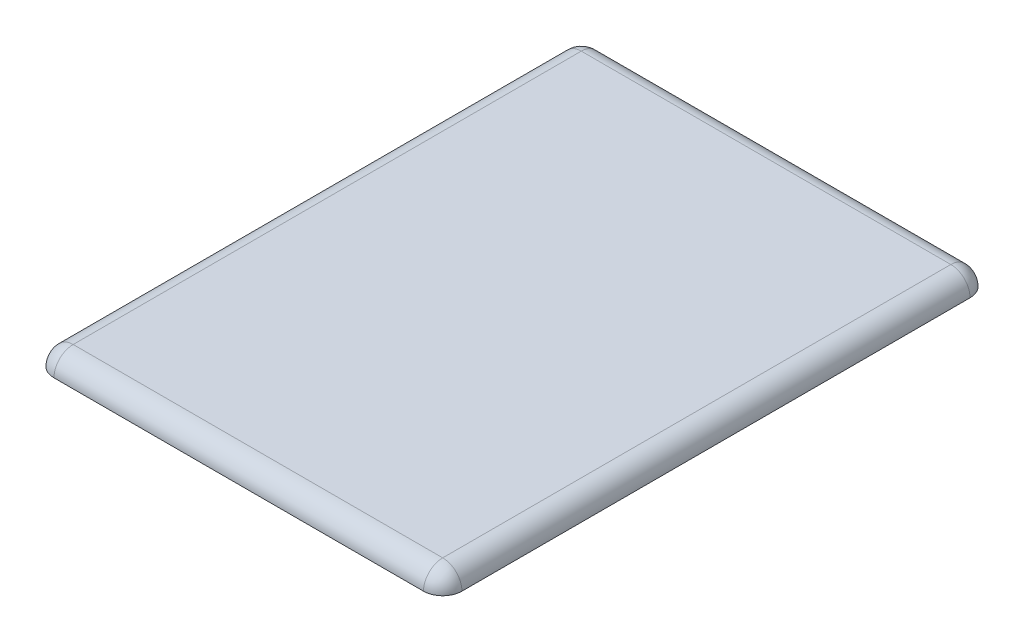
ISO-10303-21;
HEADER;
FILE_DESCRIPTION(('STEP AP214'),'2;1');
FILE_NAME('part.step','',(''),(''),'','','');
FILE_SCHEMA(('AUTOMOTIVE_DESIGN { 1 0 10303 214 1 1 1 1 }'));
ENDSEC;
DATA;
#1=APPLICATION_CONTEXT('core data for automotive mechanical design processes');
#2=APPLICATION_PROTOCOL_DEFINITION('international standard','automotive_design',2000,#1);
#3=PRODUCT_CONTEXT('',#1,'mechanical');
#4=PRODUCT('Part','Part','',(#3));
#5=PRODUCT_RELATED_PRODUCT_CATEGORY('part','',(#4));
#6=PRODUCT_DEFINITION_FORMATION('','',#4);
#7=PRODUCT_DEFINITION_CONTEXT('part definition',#1,'design');
#8=PRODUCT_DEFINITION('design','',#6,#7);
#9=PRODUCT_DEFINITION_SHAPE('','',#8);
#10=(LENGTH_UNIT() NAMED_UNIT(*) SI_UNIT(.MILLI.,.METRE.));
#11=(NAMED_UNIT(*) PLANE_ANGLE_UNIT() SI_UNIT($,.RADIAN.));
#12=(NAMED_UNIT(*) SI_UNIT($,.STERADIAN.) SOLID_ANGLE_UNIT());
#13=UNCERTAINTY_MEASURE_WITH_UNIT(LENGTH_MEASURE(1.E-05),#10,'distance_accuracy_value','');
#14=(GEOMETRIC_REPRESENTATION_CONTEXT(3) GLOBAL_UNCERTAINTY_ASSIGNED_CONTEXT((#13)) GLOBAL_UNIT_ASSIGNED_CONTEXT((#10,
#11,#12)) REPRESENTATION_CONTEXT('',''));
#15=CARTESIAN_POINT('',(0.,0.,0.));
#16=DIRECTION('',(0.,0.,1.));
#17=DIRECTION('',(1.,0.,0.));
#18=AXIS2_PLACEMENT_3D('',#15,#16,#17);
#19=CARTESIAN_POINT('',(45.,-5.,-63.));
#20=DIRECTION('',(-1.,0.,0.));
#21=DIRECTION('',(0.,0.,1.));
#22=AXIS2_PLACEMENT_3D('',#19,#20,#21);
#23=PLANE('',#22);
#24=DIRECTION('',(0.,0.,1.));
#25=VECTOR('',#24,1.);
#26=CARTESIAN_POINT('',(45.,0.,-63.));
#27=LINE('',#26,#25);
#28=CARTESIAN_POINT('',(45.,0.,-63.));
#29=VERTEX_POINT('',#28);
#30=CARTESIAN_POINT('',(45.,0.,-12.5));
#31=VERTEX_POINT('',#30);
#32=EDGE_CURVE('E252',#29,#31,#27,.T.);
#33=ORIENTED_EDGE('',*,*,#32,.T.);
#34=DIRECTION('',(0.,1.,0.));
#35=VECTOR('',#34,1.);
#36=CARTESIAN_POINT('',(45.,-5.,-12.5));
#37=LINE('',#36,#35);
#38=CARTESIAN_POINT('',(45.,-5.,-12.5));
#39=VERTEX_POINT('',#38);
#40=EDGE_CURVE('E170',#39,#31,#37,.T.);
#41=ORIENTED_EDGE('',*,*,#40,.F.);
#42=DIRECTION('',(0.,0.,1.));
#43=VECTOR('',#42,1.);
#44=CARTESIAN_POINT('',(45.,-5.,-63.));
#45=LINE('',#44,#43);
#46=CARTESIAN_POINT('',(45.,-5.,-63.));
#47=VERTEX_POINT('',#46);
#48=EDGE_CURVE('E237',#47,#39,#45,.T.);
#49=ORIENTED_EDGE('',*,*,#48,.F.);
#50=DIRECTION('',(0.,1.,0.));
#51=VECTOR('',#50,1.);
#52=CARTESIAN_POINT('',(45.,-5.,-63.));
#53=LINE('',#52,#51);
#54=EDGE_CURVE('E251',#47,#29,#53,.T.);
#55=ORIENTED_EDGE('',*,*,#54,.T.);
#56=EDGE_LOOP('',(#33,#41,#49,#55));
#57=FACE_BOUND('',#56,.T.);
#58=ADVANCED_FACE('F39',(#57),#23,.F.);
#59=CARTESIAN_POINT('',(40.,0.,-58.));
#60=DIRECTION('',(1.,0.,0.));
#61=DIRECTION('',(0.,0.,-1.));
#62=AXIS2_PLACEMENT_3D('',#59,#60,#61);
#63=PLANE('',#62);
#64=DIRECTION('',(0.,0.,1.));
#65=VECTOR('',#64,1.);
#66=CARTESIAN_POINT('',(40.,-5.,-58.));
#67=LINE('',#66,#65);
#68=CARTESIAN_POINT('',(40.,-5.,-58.));
#69=VERTEX_POINT('',#68);
#70=CARTESIAN_POINT('',(40.,-5.,-12.5));
#71=VERTEX_POINT('',#70);
#72=EDGE_CURVE('E185',#69,#71,#67,.T.);
#73=ORIENTED_EDGE('',*,*,#72,.T.);
#74=DIRECTION('',(0.,1.,0.));
#75=VECTOR('',#74,1.);
#76=CARTESIAN_POINT('',(40.,-5.,-12.5));
#77=LINE('',#76,#75);
#78=CARTESIAN_POINT('',(40.,0.,-12.5));
#79=VERTEX_POINT('',#78);
#80=EDGE_CURVE('E167',#71,#79,#77,.T.);
#81=ORIENTED_EDGE('',*,*,#80,.T.);
#82=DIRECTION('',(0.,0.,1.));
#83=VECTOR('',#82,1.);
#84=CARTESIAN_POINT('',(40.,0.,-58.));
#85=LINE('',#84,#83);
#86=CARTESIAN_POINT('',(40.,0.,-58.));
#87=VERTEX_POINT('',#86);
#88=EDGE_CURVE('E182',#87,#79,#85,.T.);
#89=ORIENTED_EDGE('',*,*,#88,.F.);
#90=DIRECTION('',(0.,-1.,0.));
#91=VECTOR('',#90,1.);
#92=CARTESIAN_POINT('',(40.,0.,-58.));
#93=LINE('',#92,#91);
#94=EDGE_CURVE('E224',#87,#69,#93,.T.);
#95=ORIENTED_EDGE('',*,*,#94,.T.);
#96=EDGE_LOOP('',(#73,#81,#89,#95));
#97=FACE_BOUND('',#96,.T.);
#98=ADVANCED_FACE('F181',(#97),#63,.F.);
#99=CARTESIAN_POINT('',(0.,5.,0.));
#100=DIRECTION('',(0.,-1.,0.));
#101=DIRECTION('',(0.,0.,-1.));
#102=AXIS2_PLACEMENT_3D('',#99,#100,#101);
#103=PLANE('',#102);
#104=DIRECTION('',(0.,0.,1.));
#105=VECTOR('',#104,1.);
#106=CARTESIAN_POINT('',(-48.,5.,0.));
#107=LINE('',#106,#105);
#108=CARTESIAN_POINT('',(-48.,5.,-66.));
#109=VERTEX_POINT('',#108);
#110=CARTESIAN_POINT('',(-48.,5.,66.));
#111=VERTEX_POINT('',#110);
#112=EDGE_CURVE('E302',#109,#111,#107,.T.);
#113=ORIENTED_EDGE('',*,*,#112,.T.);
#114=DIRECTION('',(1.,0.,0.));
#115=VECTOR('',#114,1.);
#116=CARTESIAN_POINT('',(0.,5.,66.));
#117=LINE('',#116,#115);
#118=CARTESIAN_POINT('',(48.,5.,66.));
#119=VERTEX_POINT('',#118);
#120=EDGE_CURVE('E305',#111,#119,#117,.T.);
#121=ORIENTED_EDGE('',*,*,#120,.T.);
#122=DIRECTION('',(0.,0.,-1.));
#123=VECTOR('',#122,1.);
#124=CARTESIAN_POINT('',(48.,5.,0.));
#125=LINE('',#124,#123);
#126=CARTESIAN_POINT('',(48.,5.,-66.));
#127=VERTEX_POINT('',#126);
#128=EDGE_CURVE('E296',#119,#127,#125,.T.);
#129=ORIENTED_EDGE('',*,*,#128,.T.);
#130=DIRECTION('',(-1.,0.,0.));
#131=VECTOR('',#130,1.);
#132=CARTESIAN_POINT('',(0.,5.,-66.));
#133=LINE('',#132,#131);
#134=EDGE_CURVE('E299',#127,#109,#133,.T.);
#135=ORIENTED_EDGE('',*,*,#134,.T.);
#136=EDGE_LOOP('',(#113,#121,#129,#135));
#137=FACE_BOUND('',#136,.T.);
#138=ADVANCED_FACE('F397',(#137),#103,.F.);
#139=CARTESIAN_POINT('',(0.,0.,0.));
#140=DIRECTION('',(0.,-1.,0.));
#141=DIRECTION('',(0.,0.,-1.));
#142=AXIS2_PLACEMENT_3D('',#139,#140,#141);
#143=PLANE('',#142);
#144=ORIENTED_EDGE('',*,*,#32,.F.);
#145=DIRECTION('',(1.,0.,0.));
#146=VECTOR('',#145,1.);
#147=CARTESIAN_POINT('',(-45.,0.,-63.));
#148=LINE('',#147,#146);
#149=CARTESIAN_POINT('',(-45.,0.,-63.));
#150=VERTEX_POINT('',#149);
#151=EDGE_CURVE('E263',#150,#29,#148,.T.);
#152=ORIENTED_EDGE('',*,*,#151,.F.);
#153=DIRECTION('',(0.,0.,-1.));
#154=VECTOR('',#153,1.);
#155=CARTESIAN_POINT('',(-45.,0.,-63.));
#156=LINE('',#155,#154);
#157=CARTESIAN_POINT('',(-45.,0.,63.));
#158=VERTEX_POINT('',#157);
#159=EDGE_CURVE('E259',#158,#150,#156,.T.);
#160=ORIENTED_EDGE('',*,*,#159,.F.);
#161=DIRECTION('',(-1.,0.,0.));
#162=VECTOR('',#161,1.);
#163=CARTESIAN_POINT('',(-45.,0.,63.));
#164=LINE('',#163,#162);
#165=CARTESIAN_POINT('',(45.,0.,63.));
#166=VERTEX_POINT('',#165);
#167=EDGE_CURVE('E255',#166,#158,#164,.T.);
#168=ORIENTED_EDGE('',*,*,#167,.F.);
#169=CARTESIAN_POINT('',(45.,0.,12.5));
#170=VERTEX_POINT('',#169);
#171=EDGE_CURVE('E227',#170,#166,#27,.T.);
#172=ORIENTED_EDGE('',*,*,#171,.F.);
#173=DIRECTION('',(1.,0.,0.));
#174=VECTOR('',#173,1.);
#175=CARTESIAN_POINT('',(40.,0.,12.5));
#176=LINE('',#175,#174);
#177=CARTESIAN_POINT('',(40.,0.,12.5));
#178=VERTEX_POINT('',#177);
#179=EDGE_CURVE('E175',#178,#170,#176,.T.);
#180=ORIENTED_EDGE('',*,*,#179,.F.);
#181=CARTESIAN_POINT('',(40.,0.,58.));
#182=VERTEX_POINT('',#181);
#183=EDGE_CURVE('E195',#178,#182,#85,.T.);
#184=ORIENTED_EDGE('',*,*,#183,.T.);
#185=DIRECTION('',(-1.,0.,0.));
#186=VECTOR('',#185,1.);
#187=CARTESIAN_POINT('',(-40.,0.,58.));
#188=LINE('',#187,#186);
#189=CARTESIAN_POINT('',(-40.,0.,58.));
#190=VERTEX_POINT('',#189);
#191=EDGE_CURVE('E194',#182,#190,#188,.T.);
#192=ORIENTED_EDGE('',*,*,#191,.T.);
#193=DIRECTION('',(0.,0.,-1.));
#194=VECTOR('',#193,1.);
#195=CARTESIAN_POINT('',(-40.,0.,-58.));
#196=LINE('',#195,#194);
#197=CARTESIAN_POINT('',(-40.,0.,-58.));
#198=VERTEX_POINT('',#197);
#199=EDGE_CURVE('E200',#190,#198,#196,.T.);
#200=ORIENTED_EDGE('',*,*,#199,.T.);
#201=DIRECTION('',(1.,0.,0.));
#202=VECTOR('',#201,1.);
#203=CARTESIAN_POINT('',(-40.,0.,-58.));
#204=LINE('',#203,#202);
#205=EDGE_CURVE('E192',#198,#87,#204,.T.);
#206=ORIENTED_EDGE('',*,*,#205,.T.);
#207=ORIENTED_EDGE('',*,*,#88,.T.);
#208=DIRECTION('',(1.,0.,0.));
#209=VECTOR('',#208,1.);
#210=CARTESIAN_POINT('',(40.,0.,-12.5));
#211=LINE('',#210,#209);
#212=EDGE_CURVE('E164',#79,#31,#211,.T.);
#213=ORIENTED_EDGE('',*,*,#212,.T.);
#214=EDGE_LOOP('',(#144,#152,#160,#168,#172,#180,#184,#192,#200,#206,#207,#213));
#215=FACE_BOUND('',#214,.T.);
#216=DIRECTION('',(1.,0.,0.));
#217=VECTOR('',#216,1.);
#218=CARTESIAN_POINT('',(-53.,0.,71.));
#219=LINE('',#218,#217);
#220=CARTESIAN_POINT('',(-48.,0.,71.));
#221=VERTEX_POINT('',#220);
#222=CARTESIAN_POINT('',(48.,0.,71.));
#223=VERTEX_POINT('',#222);
#224=EDGE_CURVE('E292',#221,#223,#219,.T.);
#225=ORIENTED_EDGE('',*,*,#224,.F.);
#226=CARTESIAN_POINT('',(-48.,0.,66.));
#227=DIRECTION('',(0.,-1.,0.));
#228=DIRECTION('',(0.,0.,-1.));
#229=AXIS2_PLACEMENT_3D('',#226,#227,#228);
#230=CIRCLE('',#229,5.);
#231=CARTESIAN_POINT('',(-53.,0.,66.));
#232=VERTEX_POINT('',#231);
#233=EDGE_CURVE('E11',#221,#232,#230,.T.);
#234=ORIENTED_EDGE('',*,*,#233,.T.);
#235=DIRECTION('',(0.,0.,1.));
#236=VECTOR('',#235,1.);
#237=CARTESIAN_POINT('',(-53.,0.,71.));
#238=LINE('',#237,#236);
#239=CARTESIAN_POINT('',(-53.,0.,-66.));
#240=VERTEX_POINT('',#239);
#241=EDGE_CURVE('E288',#240,#232,#238,.T.);
#242=ORIENTED_EDGE('',*,*,#241,.F.);
#243=CARTESIAN_POINT('',(-48.,0.,-66.));
#244=DIRECTION('',(0.,-1.,0.));
#245=DIRECTION('',(0.,0.,-1.));
#246=AXIS2_PLACEMENT_3D('',#243,#244,#245);
#247=CIRCLE('',#246,5.);
#248=CARTESIAN_POINT('',(-48.,0.,-71.));
#249=VERTEX_POINT('',#248);
#250=EDGE_CURVE('E49',#240,#249,#247,.T.);
#251=ORIENTED_EDGE('',*,*,#250,.T.);
#252=DIRECTION('',(-1.,0.,0.));
#253=VECTOR('',#252,1.);
#254=CARTESIAN_POINT('',(-53.,0.,-71.));
#255=LINE('',#254,#253);
#256=CARTESIAN_POINT('',(48.,0.,-71.));
#257=VERTEX_POINT('',#256);
#258=EDGE_CURVE('E284',#257,#249,#255,.T.);
#259=ORIENTED_EDGE('',*,*,#258,.F.);
#260=CARTESIAN_POINT('',(48.,0.,-66.));
#261=DIRECTION('',(0.,-1.,0.));
#262=DIRECTION('',(0.,0.,-1.));
#263=AXIS2_PLACEMENT_3D('',#260,#261,#262);
#264=CIRCLE('',#263,5.);
#265=CARTESIAN_POINT('',(53.,0.,-66.));
#266=VERTEX_POINT('',#265);
#267=EDGE_CURVE('E57',#257,#266,#264,.T.);
#268=ORIENTED_EDGE('',*,*,#267,.T.);
#269=DIRECTION('',(0.,0.,-1.));
#270=VECTOR('',#269,1.);
#271=CARTESIAN_POINT('',(53.,0.,71.));
#272=LINE('',#271,#270);
#273=CARTESIAN_POINT('',(53.,0.,66.));
#274=VERTEX_POINT('',#273);
#275=EDGE_CURVE('E62',#274,#266,#272,.T.);
#276=ORIENTED_EDGE('',*,*,#275,.F.);
#277=CARTESIAN_POINT('',(48.,0.,66.));
#278=DIRECTION('',(0.,-1.,0.));
#279=DIRECTION('',(0.,0.,-1.));
#280=AXIS2_PLACEMENT_3D('',#277,#278,#279);
#281=CIRCLE('',#280,5.);
#282=EDGE_CURVE('E309',#274,#223,#281,.T.);
#283=ORIENTED_EDGE('',*,*,#282,.T.);
#284=EDGE_LOOP('',(#225,#234,#242,#251,#259,#268,#276,#283));
#285=FACE_BOUND('',#284,.T.);
#286=ADVANCED_FACE('F189',(#215,#285),#143,.T.);
#287=CARTESIAN_POINT('',(45.,-5.,12.5));
#288=VERTEX_POINT('',#287);
#289=CARTESIAN_POINT('',(45.,-5.,63.));
#290=VERTEX_POINT('',#289);
#291=EDGE_CURVE('E242',#288,#290,#45,.T.);
#292=ORIENTED_EDGE('',*,*,#291,.F.);
#293=DIRECTION('',(0.,-1.,0.));
#294=VECTOR('',#293,1.);
#295=CARTESIAN_POINT('',(45.,-5.,12.5));
#296=LINE('',#295,#294);
#297=EDGE_CURVE('E187',#170,#288,#296,.T.);
#298=ORIENTED_EDGE('',*,*,#297,.F.);
#299=ORIENTED_EDGE('',*,*,#171,.T.);
#300=DIRECTION('',(0.,1.,0.));
#301=VECTOR('',#300,1.);
#302=CARTESIAN_POINT('',(45.,-5.,63.));
#303=LINE('',#302,#301);
#304=EDGE_CURVE('E278',#290,#166,#303,.T.);
#305=ORIENTED_EDGE('',*,*,#304,.F.);
#306=EDGE_LOOP('',(#292,#298,#299,#305));
#307=FACE_BOUND('',#306,.T.);
#308=ADVANCED_FACE('F370',(#307),#23,.F.);
#309=CARTESIAN_POINT('',(-45.,-5.,63.));
#310=DIRECTION('',(0.,0.,-1.));
#311=DIRECTION('',(-1.,0.,0.));
#312=AXIS2_PLACEMENT_3D('',#309,#310,#311);
#313=PLANE('',#312);
#314=ORIENTED_EDGE('',*,*,#167,.T.);
#315=DIRECTION('',(0.,1.,0.));
#316=VECTOR('',#315,1.);
#317=CARTESIAN_POINT('',(-45.,-5.,63.));
#318=LINE('',#317,#316);
#319=CARTESIAN_POINT('',(-45.,-5.,63.));
#320=VERTEX_POINT('',#319);
#321=EDGE_CURVE('E274',#320,#158,#318,.T.);
#322=ORIENTED_EDGE('',*,*,#321,.F.);
#323=DIRECTION('',(-1.,0.,0.));
#324=VECTOR('',#323,1.);
#325=CARTESIAN_POINT('',(-45.,-5.,63.));
#326=LINE('',#325,#324);
#327=EDGE_CURVE('E241',#290,#320,#326,.T.);
#328=ORIENTED_EDGE('',*,*,#327,.F.);
#329=ORIENTED_EDGE('',*,*,#304,.T.);
#330=EDGE_LOOP('',(#314,#322,#328,#329));
#331=FACE_BOUND('',#330,.T.);
#332=ADVANCED_FACE('F381',(#331),#313,.F.);
#333=CARTESIAN_POINT('',(-45.,-5.,-63.));
#334=DIRECTION('',(1.,0.,0.));
#335=DIRECTION('',(0.,0.,-1.));
#336=AXIS2_PLACEMENT_3D('',#333,#334,#335);
#337=PLANE('',#336);
#338=ORIENTED_EDGE('',*,*,#159,.T.);
#339=DIRECTION('',(0.,1.,0.));
#340=VECTOR('',#339,1.);
#341=CARTESIAN_POINT('',(-45.,-5.,-63.));
#342=LINE('',#341,#340);
#343=CARTESIAN_POINT('',(-45.,-5.,-63.));
#344=VERTEX_POINT('',#343);
#345=EDGE_CURVE('E270',#344,#150,#342,.T.);
#346=ORIENTED_EDGE('',*,*,#345,.F.);
#347=DIRECTION('',(0.,0.,-1.));
#348=VECTOR('',#347,1.);
#349=CARTESIAN_POINT('',(-45.,-5.,-63.));
#350=LINE('',#349,#348);
#351=EDGE_CURVE('E245',#320,#344,#350,.T.);
#352=ORIENTED_EDGE('',*,*,#351,.F.);
#353=ORIENTED_EDGE('',*,*,#321,.T.);
#354=EDGE_LOOP('',(#338,#346,#352,#353));
#355=FACE_BOUND('',#354,.T.);
#356=ADVANCED_FACE('F385',(#355),#337,.F.);
#357=CARTESIAN_POINT('',(-45.,-5.,-63.));
#358=DIRECTION('',(0.,0.,1.));
#359=DIRECTION('',(1.,0.,0.));
#360=AXIS2_PLACEMENT_3D('',#357,#358,#359);
#361=PLANE('',#360);
#362=ORIENTED_EDGE('',*,*,#151,.T.);
#363=ORIENTED_EDGE('',*,*,#54,.F.);
#364=DIRECTION('',(1.,0.,0.));
#365=VECTOR('',#364,1.);
#366=CARTESIAN_POINT('',(-45.,-5.,-63.));
#367=LINE('',#366,#365);
#368=EDGE_CURVE('E248',#344,#47,#367,.T.);
#369=ORIENTED_EDGE('',*,*,#368,.F.);
#370=ORIENTED_EDGE('',*,*,#345,.T.);
#371=EDGE_LOOP('',(#362,#363,#369,#370));
#372=FACE_BOUND('',#371,.T.);
#373=ADVANCED_FACE('F390',(#372),#361,.F.);
#374=CARTESIAN_POINT('',(0.,-5.,0.));
#375=DIRECTION('',(0.,1.,0.));
#376=DIRECTION('',(0.,0.,1.));
#377=AXIS2_PLACEMENT_3D('',#374,#375,#376);
#378=PLANE('',#377);
#379=ORIENTED_EDGE('',*,*,#48,.T.);
#380=DIRECTION('',(1.,0.,0.));
#381=VECTOR('',#380,1.);
#382=CARTESIAN_POINT('',(40.,-5.,-12.5));
#383=LINE('',#382,#381);
#384=EDGE_CURVE('E354',#71,#39,#383,.T.);
#385=ORIENTED_EDGE('',*,*,#384,.F.);
#386=ORIENTED_EDGE('',*,*,#72,.F.);
#387=DIRECTION('',(1.,0.,0.));
#388=VECTOR('',#387,1.);
#389=CARTESIAN_POINT('',(-40.,-5.,-58.));
#390=LINE('',#389,#388);
#391=CARTESIAN_POINT('',(-40.,-5.,-58.));
#392=VERTEX_POINT('',#391);
#393=EDGE_CURVE('E202',#392,#69,#390,.T.);
#394=ORIENTED_EDGE('',*,*,#393,.F.);
#395=DIRECTION('',(0.,0.,-1.));
#396=VECTOR('',#395,1.);
#397=CARTESIAN_POINT('',(-40.,-5.,-58.));
#398=LINE('',#397,#396);
#399=CARTESIAN_POINT('',(-40.,-5.,58.));
#400=VERTEX_POINT('',#399);
#401=EDGE_CURVE('E217',#400,#392,#398,.T.);
#402=ORIENTED_EDGE('',*,*,#401,.F.);
#403=DIRECTION('',(-1.,0.,0.));
#404=VECTOR('',#403,1.);
#405=CARTESIAN_POINT('',(-40.,-5.,58.));
#406=LINE('',#405,#404);
#407=CARTESIAN_POINT('',(40.,-5.,58.));
#408=VERTEX_POINT('',#407);
#409=EDGE_CURVE('E212',#408,#400,#406,.T.);
#410=ORIENTED_EDGE('',*,*,#409,.F.);
#411=CARTESIAN_POINT('',(40.,-5.,12.5));
#412=VERTEX_POINT('',#411);
#413=EDGE_CURVE('E213',#412,#408,#67,.T.);
#414=ORIENTED_EDGE('',*,*,#413,.F.);
#415=DIRECTION('',(1.,0.,0.));
#416=VECTOR('',#415,1.);
#417=CARTESIAN_POINT('',(40.,-5.,12.5));
#418=LINE('',#417,#416);
#419=EDGE_CURVE('E357',#412,#288,#418,.T.);
#420=ORIENTED_EDGE('',*,*,#419,.T.);
#421=ORIENTED_EDGE('',*,*,#291,.T.);
#422=ORIENTED_EDGE('',*,*,#327,.T.);
#423=ORIENTED_EDGE('',*,*,#351,.T.);
#424=ORIENTED_EDGE('',*,*,#368,.T.);
#425=EDGE_LOOP('',(#379,#385,#386,#394,#402,#410,#414,#420,#421,#422,#423,#424));
#426=FACE_BOUND('',#425,.T.);
#427=ADVANCED_FACE('F377',(#426),#378,.F.);
#428=ORIENTED_EDGE('',*,*,#183,.F.);
#429=DIRECTION('',(0.,-1.,0.));
#430=VECTOR('',#429,1.);
#431=CARTESIAN_POINT('',(40.,-5.,12.5));
#432=LINE('',#431,#430);
#433=EDGE_CURVE('E176',#178,#412,#432,.T.);
#434=ORIENTED_EDGE('',*,*,#433,.T.);
#435=ORIENTED_EDGE('',*,*,#413,.T.);
#436=DIRECTION('',(0.,-1.,0.));
#437=VECTOR('',#436,1.);
#438=CARTESIAN_POINT('',(40.,0.,58.));
#439=LINE('',#438,#437);
#440=EDGE_CURVE('E209',#182,#408,#439,.T.);
#441=ORIENTED_EDGE('',*,*,#440,.F.);
#442=EDGE_LOOP('',(#428,#434,#435,#441));
#443=FACE_BOUND('',#442,.T.);
#444=ADVANCED_FACE('F399',(#443),#63,.F.);
#445=CARTESIAN_POINT('',(-40.,0.,-58.));
#446=DIRECTION('',(0.,0.,-1.));
#447=DIRECTION('',(-1.,0.,0.));
#448=AXIS2_PLACEMENT_3D('',#445,#446,#447);
#449=PLANE('',#448);
#450=ORIENTED_EDGE('',*,*,#393,.T.);
#451=ORIENTED_EDGE('',*,*,#94,.F.);
#452=ORIENTED_EDGE('',*,*,#205,.F.);
#453=DIRECTION('',(0.,-1.,0.));
#454=VECTOR('',#453,1.);
#455=CARTESIAN_POINT('',(-40.,0.,-58.));
#456=LINE('',#455,#454);
#457=EDGE_CURVE('E228',#198,#392,#456,.T.);
#458=ORIENTED_EDGE('',*,*,#457,.T.);
#459=EDGE_LOOP('',(#450,#451,#452,#458));
#460=FACE_BOUND('',#459,.T.);
#461=ADVANCED_FACE('F461',(#460),#449,.F.);
#462=CARTESIAN_POINT('',(-40.,0.,-58.));
#463=DIRECTION('',(-1.,0.,0.));
#464=DIRECTION('',(0.,0.,1.));
#465=AXIS2_PLACEMENT_3D('',#462,#463,#464);
#466=PLANE('',#465);
#467=ORIENTED_EDGE('',*,*,#401,.T.);
#468=ORIENTED_EDGE('',*,*,#457,.F.);
#469=ORIENTED_EDGE('',*,*,#199,.F.);
#470=DIRECTION('',(0.,-1.,0.));
#471=VECTOR('',#470,1.);
#472=CARTESIAN_POINT('',(-40.,0.,58.));
#473=LINE('',#472,#471);
#474=EDGE_CURVE('E231',#190,#400,#473,.T.);
#475=ORIENTED_EDGE('',*,*,#474,.T.);
#476=EDGE_LOOP('',(#467,#468,#469,#475));
#477=FACE_BOUND('',#476,.T.);
#478=ADVANCED_FACE('F464',(#477),#466,.F.);
#479=CARTESIAN_POINT('',(-40.,0.,58.));
#480=DIRECTION('',(0.,0.,1.));
#481=DIRECTION('',(1.,0.,0.));
#482=AXIS2_PLACEMENT_3D('',#479,#480,#481);
#483=PLANE('',#482);
#484=ORIENTED_EDGE('',*,*,#409,.T.);
#485=ORIENTED_EDGE('',*,*,#474,.F.);
#486=ORIENTED_EDGE('',*,*,#191,.F.);
#487=ORIENTED_EDGE('',*,*,#440,.T.);
#488=EDGE_LOOP('',(#484,#485,#486,#487));
#489=FACE_BOUND('',#488,.T.);
#490=ADVANCED_FACE('F458',(#489),#483,.F.);
#491=CARTESIAN_POINT('',(40.,-5.,-12.5));
#492=DIRECTION('',(0.,0.,-1.));
#493=DIRECTION('',(-1.,0.,0.));
#494=AXIS2_PLACEMENT_3D('',#491,#492,#493);
#495=PLANE('',#494);
#496=ORIENTED_EDGE('',*,*,#40,.T.);
#497=ORIENTED_EDGE('',*,*,#212,.F.);
#498=ORIENTED_EDGE('',*,*,#80,.F.);
#499=ORIENTED_EDGE('',*,*,#384,.T.);
#500=EDGE_LOOP('',(#496,#497,#498,#499));
#501=FACE_BOUND('',#500,.T.);
#502=ADVANCED_FACE('F166',(#501),#495,.F.);
#503=CARTESIAN_POINT('',(40.,-5.,12.5));
#504=DIRECTION('',(0.,0.,1.));
#505=DIRECTION('',(1.,0.,0.));
#506=AXIS2_PLACEMENT_3D('',#503,#504,#505);
#507=PLANE('',#506);
#508=ORIENTED_EDGE('',*,*,#297,.T.);
#509=ORIENTED_EDGE('',*,*,#419,.F.);
#510=ORIENTED_EDGE('',*,*,#433,.F.);
#511=ORIENTED_EDGE('',*,*,#179,.T.);
#512=EDGE_LOOP('',(#508,#509,#510,#511));
#513=FACE_BOUND('',#512,.T.);
#514=ADVANCED_FACE('F364',(#513),#507,.F.);
#515=CARTESIAN_POINT('',(0.,0.,-66.));
#516=DIRECTION('',(-1.,0.,0.));
#517=DIRECTION('',(0.,0.,1.));
#518=AXIS2_PLACEMENT_3D('',#515,#516,#517);
#519=CYLINDRICAL_SURFACE('',#518,5.);
#520=CARTESIAN_POINT('',(48.,0.,-66.));
#521=DIRECTION('',(1.,0.,0.));
#522=DIRECTION('',(0.,1.,0.));
#523=AXIS2_PLACEMENT_3D('',#520,#521,#522);
#524=CIRCLE('',#523,5.);
#525=EDGE_CURVE('E337',#257,#127,#524,.T.);
#526=ORIENTED_EDGE('',*,*,#525,.F.);
#527=ORIENTED_EDGE('',*,*,#258,.T.);
#528=CARTESIAN_POINT('',(-48.,0.,-66.));
#529=DIRECTION('',(-1.,0.,0.));
#530=DIRECTION('',(0.,0.,1.));
#531=AXIS2_PLACEMENT_3D('',#528,#529,#530);
#532=CIRCLE('',#531,5.);
#533=EDGE_CURVE('E43',#109,#249,#532,.T.);
#534=ORIENTED_EDGE('',*,*,#533,.F.);
#535=ORIENTED_EDGE('',*,*,#134,.F.);
#536=EDGE_LOOP('',(#526,#527,#534,#535));
#537=FACE_BOUND('',#536,.T.);
#538=ADVANCED_FACE('F41',(#537),#519,.T.);
#539=CARTESIAN_POINT('',(-48.,0.,-66.));
#540=DIRECTION('',(0.,0.,-1.));
#541=DIRECTION('',(-1.,0.,0.));
#542=AXIS2_PLACEMENT_3D('',#539,#540,#541);
#543=SPHERICAL_SURFACE('',#542,5.);
#544=ORIENTED_EDGE('',*,*,#533,.T.);
#545=ORIENTED_EDGE('',*,*,#250,.F.);
#546=CARTESIAN_POINT('',(-48.,0.,-66.));
#547=DIRECTION('',(0.,0.,-1.));
#548=DIRECTION('',(-1.,0.,0.));
#549=AXIS2_PLACEMENT_3D('',#546,#547,#548);
#550=CIRCLE('',#549,5.);
#551=EDGE_CURVE('E334',#109,#240,#550,.F.);
#552=ORIENTED_EDGE('',*,*,#551,.F.);
#553=EDGE_LOOP('',(#544,#545,#552));
#554=FACE_BOUND('',#553,.T.);
#555=ADVANCED_FACE('F435',(#554),#543,.T.);
#556=CARTESIAN_POINT('',(48.,0.,-66.));
#557=DIRECTION('',(0.,0.,-1.));
#558=DIRECTION('',(-1.,0.,0.));
#559=AXIS2_PLACEMENT_3D('',#556,#557,#558);
#560=SPHERICAL_SURFACE('',#559,5.);
#561=ORIENTED_EDGE('',*,*,#267,.F.);
#562=ORIENTED_EDGE('',*,*,#525,.T.);
#563=CARTESIAN_POINT('',(48.,0.,-66.));
#564=DIRECTION('',(0.,0.,-1.));
#565=DIRECTION('',(-1.,0.,0.));
#566=AXIS2_PLACEMENT_3D('',#563,#564,#565);
#567=CIRCLE('',#566,5.);
#568=EDGE_CURVE('E330',#266,#127,#567,.F.);
#569=ORIENTED_EDGE('',*,*,#568,.F.);
#570=EDGE_LOOP('',(#561,#562,#569));
#571=FACE_BOUND('',#570,.T.);
#572=ADVANCED_FACE('F432',(#571),#560,.T.);
#573=CARTESIAN_POINT('',(-48.,0.,0.));
#574=DIRECTION('',(0.,0.,1.));
#575=DIRECTION('',(1.,0.,0.));
#576=AXIS2_PLACEMENT_3D('',#573,#574,#575);
#577=CYLINDRICAL_SURFACE('',#576,5.);
#578=ORIENTED_EDGE('',*,*,#551,.T.);
#579=ORIENTED_EDGE('',*,*,#241,.T.);
#580=CARTESIAN_POINT('',(-48.,0.,66.));
#581=DIRECTION('',(0.,0.,1.));
#582=DIRECTION('',(1.,0.,0.));
#583=AXIS2_PLACEMENT_3D('',#580,#581,#582);
#584=CIRCLE('',#583,5.);
#585=EDGE_CURVE('E326',#111,#232,#584,.T.);
#586=ORIENTED_EDGE('',*,*,#585,.F.);
#587=ORIENTED_EDGE('',*,*,#112,.F.);
#588=EDGE_LOOP('',(#578,#579,#586,#587));
#589=FACE_BOUND('',#588,.T.);
#590=ADVANCED_FACE('F428',(#589),#577,.T.);
#591=CARTESIAN_POINT('',(48.,0.,0.));
#592=DIRECTION('',(0.,0.,-1.));
#593=DIRECTION('',(-1.,0.,0.));
#594=AXIS2_PLACEMENT_3D('',#591,#592,#593);
#595=CYLINDRICAL_SURFACE('',#594,5.);
#596=ORIENTED_EDGE('',*,*,#568,.T.);
#597=ORIENTED_EDGE('',*,*,#128,.F.);
#598=CARTESIAN_POINT('',(48.,0.,66.));
#599=DIRECTION('',(0.,0.,1.));
#600=DIRECTION('',(1.,0.,0.));
#601=AXIS2_PLACEMENT_3D('',#598,#599,#600);
#602=CIRCLE('',#601,5.);
#603=EDGE_CURVE('E322',#274,#119,#602,.T.);
#604=ORIENTED_EDGE('',*,*,#603,.F.);
#605=ORIENTED_EDGE('',*,*,#275,.T.);
#606=EDGE_LOOP('',(#596,#597,#604,#605));
#607=FACE_BOUND('',#606,.T.);
#608=ADVANCED_FACE('F424',(#607),#595,.T.);
#609=CARTESIAN_POINT('',(-48.,0.,66.));
#610=DIRECTION('',(-1.,0.,0.));
#611=DIRECTION('',(0.,0.,1.));
#612=AXIS2_PLACEMENT_3D('',#609,#610,#611);
#613=SPHERICAL_SURFACE('',#612,5.);
#614=ORIENTED_EDGE('',*,*,#585,.T.);
#615=ORIENTED_EDGE('',*,*,#233,.F.);
#616=CARTESIAN_POINT('',(-48.,0.,66.));
#617=DIRECTION('',(-1.,0.,0.));
#618=DIRECTION('',(0.,0.,1.));
#619=AXIS2_PLACEMENT_3D('',#616,#617,#618);
#620=CIRCLE('',#619,5.);
#621=EDGE_CURVE('E319',#111,#221,#620,.F.);
#622=ORIENTED_EDGE('',*,*,#621,.F.);
#623=EDGE_LOOP('',(#614,#615,#622));
#624=FACE_BOUND('',#623,.T.);
#625=ADVANCED_FACE('F420',(#624),#613,.T.);
#626=CARTESIAN_POINT('',(48.,0.,66.));
#627=DIRECTION('',(1.,0.,0.));
#628=DIRECTION('',(0.,0.,-1.));
#629=AXIS2_PLACEMENT_3D('',#626,#627,#628);
#630=SPHERICAL_SURFACE('',#629,5.);
#631=ORIENTED_EDGE('',*,*,#282,.F.);
#632=ORIENTED_EDGE('',*,*,#603,.T.);
#633=CARTESIAN_POINT('',(48.,0.,66.));
#634=DIRECTION('',(1.,0.,0.));
#635=DIRECTION('',(0.,0.,-1.));
#636=AXIS2_PLACEMENT_3D('',#633,#634,#635);
#637=CIRCLE('',#636,5.);
#638=EDGE_CURVE('E316',#223,#119,#637,.F.);
#639=ORIENTED_EDGE('',*,*,#638,.F.);
#640=EDGE_LOOP('',(#631,#632,#639));
#641=FACE_BOUND('',#640,.T.);
#642=ADVANCED_FACE('F416',(#641),#630,.T.);
#643=CARTESIAN_POINT('',(0.,0.,66.));
#644=DIRECTION('',(1.,0.,0.));
#645=DIRECTION('',(0.,0.,-1.));
#646=AXIS2_PLACEMENT_3D('',#643,#644,#645);
#647=CYLINDRICAL_SURFACE('',#646,5.);
#648=ORIENTED_EDGE('',*,*,#621,.T.);
#649=ORIENTED_EDGE('',*,*,#224,.T.);
#650=ORIENTED_EDGE('',*,*,#638,.T.);
#651=ORIENTED_EDGE('',*,*,#120,.F.);
#652=EDGE_LOOP('',(#648,#649,#650,#651));
#653=FACE_BOUND('',#652,.T.);
#654=ADVANCED_FACE('F413',(#653),#647,.T.);
#655=CLOSED_SHELL('',(#58,#98,#138,#286,#308,#332,#356,#373,#427,#444,#461,#478,#490,#502,#514,
#538,#555,#572,#590,#608,#625,#642,#654));
#656=MANIFOLD_SOLID_BREP('B2',#655);
#657=ADVANCED_BREP_SHAPE_REPRESENTATION('',(#18,#656),#14);
#658=SHAPE_DEFINITION_REPRESENTATION(#9,#657);
ENDSEC;
END-ISO-10303-21;
